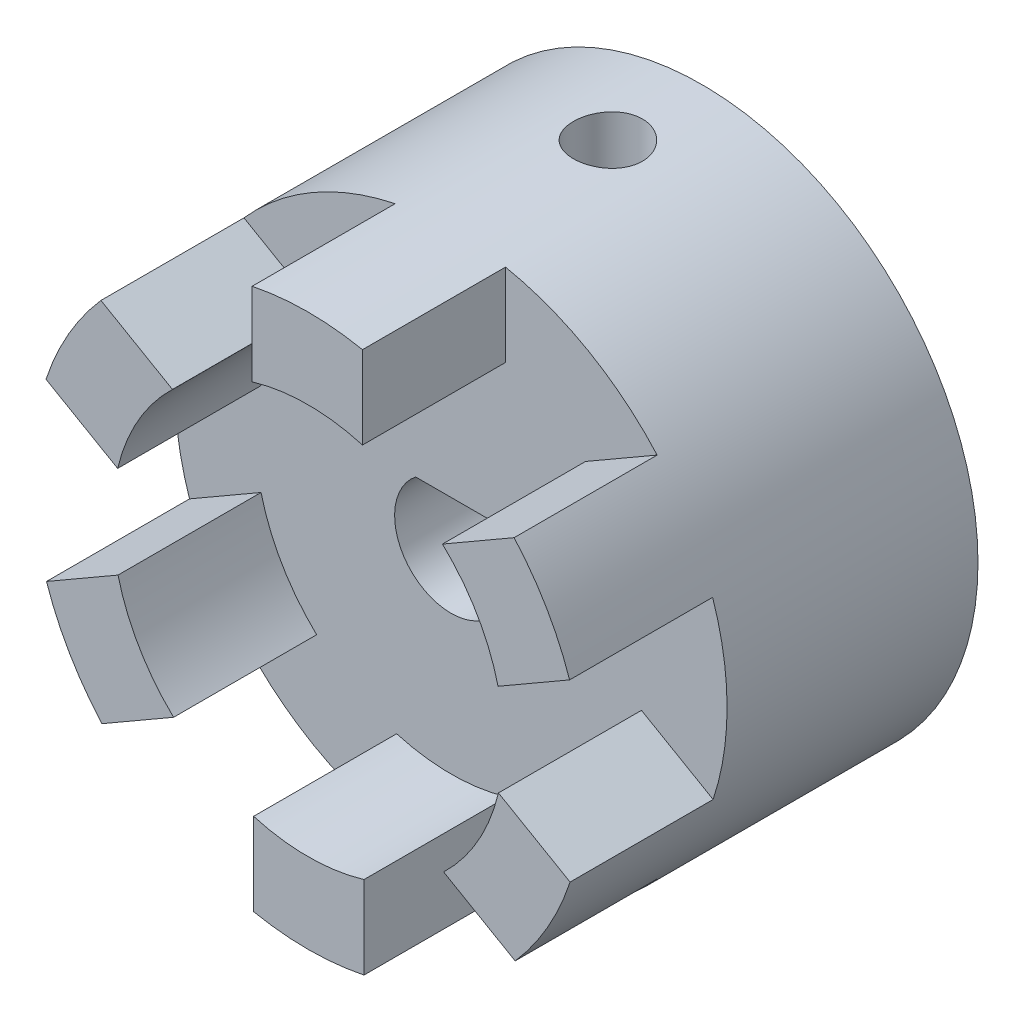
ISO-10303-21;
HEADER;
FILE_DESCRIPTION(('STEP AP214'),'2;1');
FILE_NAME('part.step','',(''),(''),'','','');
FILE_SCHEMA(('AUTOMOTIVE_DESIGN { 1 0 10303 214 1 1 1 1 }'));
ENDSEC;
DATA;
#1=APPLICATION_CONTEXT('core data for automotive mechanical design processes');
#2=APPLICATION_PROTOCOL_DEFINITION('international standard','automotive_design',2000,#1);
#3=PRODUCT_CONTEXT('',#1,'mechanical');
#4=PRODUCT('Part','Part','',(#3));
#5=PRODUCT_RELATED_PRODUCT_CATEGORY('part','',(#4));
#6=PRODUCT_DEFINITION_FORMATION('','',#4);
#7=PRODUCT_DEFINITION_CONTEXT('part definition',#1,'design');
#8=PRODUCT_DEFINITION('design','',#6,#7);
#9=PRODUCT_DEFINITION_SHAPE('','',#8);
#10=(LENGTH_UNIT() NAMED_UNIT(*) SI_UNIT(.MILLI.,.METRE.));
#11=(NAMED_UNIT(*) PLANE_ANGLE_UNIT() SI_UNIT($,.RADIAN.));
#12=(NAMED_UNIT(*) SI_UNIT($,.STERADIAN.) SOLID_ANGLE_UNIT());
#13=UNCERTAINTY_MEASURE_WITH_UNIT(LENGTH_MEASURE(1.E-05),#10,'distance_accuracy_value','');
#14=(GEOMETRIC_REPRESENTATION_CONTEXT(3) GLOBAL_UNCERTAINTY_ASSIGNED_CONTEXT((#13)) GLOBAL_UNIT_ASSIGNED_CONTEXT((#10,
#11,#12)) REPRESENTATION_CONTEXT('',''));
#15=CARTESIAN_POINT('',(0.,0.,0.));
#16=DIRECTION('',(0.,0.,1.));
#17=DIRECTION('',(1.,0.,0.));
#18=AXIS2_PLACEMENT_3D('',#15,#16,#17);
#19=CARTESIAN_POINT('',(0.,0.,11.4));
#20=DIRECTION('',(0.,0.,-1.));
#21=DIRECTION('',(-1.,0.,0.));
#22=AXIS2_PLACEMENT_3D('',#19,#20,#21);
#23=CYLINDRICAL_SURFACE('',#22,22.);
#24=DIRECTION('',(0.,0.,-1.));
#25=VECTOR('',#24,1.);
#26=CARTESIAN_POINT('',(4.33944019373239,21.5677828903441,11.4));
#27=LINE('',#26,#25);
#28=CARTESIAN_POINT('',(4.33944019373239,21.5677828903441,11.4));
#29=VERTEX_POINT('',#28);
#30=CARTESIAN_POINT('',(4.33944019373239,21.5677828903441,0.));
#31=VERTEX_POINT('',#30);
#32=EDGE_CURVE('E11',#29,#31,#27,.T.);
#33=ORIENTED_EDGE('',*,*,#32,.T.);
#34=CARTESIAN_POINT('',(0.,0.,0.));
#35=DIRECTION('',(0.,0.,1.));
#36=DIRECTION('',(1.,0.,0.));
#37=AXIS2_PLACEMENT_3D('',#34,#35,#36);
#38=CIRCLE('',#37,22.);
#39=CARTESIAN_POINT('',(16.426618960713,14.6344179767951,0.));
#40=VERTEX_POINT('',#39);
#41=EDGE_CURVE('E417',#40,#31,#38,.T.);
#42=ORIENTED_EDGE('',*,*,#41,.F.);
#43=DIRECTION('',(0.,0.,-1.));
#44=VECTOR('',#43,1.);
#45=CARTESIAN_POINT('',(16.426618960713,14.6344179767951,11.4));
#46=LINE('',#45,#44);
#47=CARTESIAN_POINT('',(16.426618960713,14.6344179767951,11.4));
#48=VERTEX_POINT('',#47);
#49=EDGE_CURVE('E409',#48,#40,#46,.T.);
#50=ORIENTED_EDGE('',*,*,#49,.F.);
#51=CARTESIAN_POINT('',(0.,0.,11.4));
#52=DIRECTION('',(0.,0.,1.));
#53=DIRECTION('',(1.,0.,0.));
#54=AXIS2_PLACEMENT_3D('',#51,#52,#53);
#55=CIRCLE('',#54,22.);
#56=CARTESIAN_POINT('',(20.8479679832116,7.02582599919653,11.4));
#57=VERTEX_POINT('',#56);
#58=EDGE_CURVE('E381',#57,#48,#55,.T.);
#59=ORIENTED_EDGE('',*,*,#58,.F.);
#60=DIRECTION('',(0.,0.,-1.));
#61=VECTOR('',#60,1.);
#62=CARTESIAN_POINT('',(20.8479679832116,7.02582599919653,11.4));
#63=LINE('',#62,#61);
#64=CARTESIAN_POINT('',(20.8479679832116,7.02582599919653,0.));
#65=VERTEX_POINT('',#64);
#66=EDGE_CURVE('E413',#57,#65,#63,.T.);
#67=ORIENTED_EDGE('',*,*,#66,.T.);
#68=CARTESIAN_POINT('',(20.8870872178607,-6.90866032986705,0.));
#69=VERTEX_POINT('',#68);
#70=EDGE_CURVE('E973',#69,#65,#38,.T.);
#71=ORIENTED_EDGE('',*,*,#70,.F.);
#72=DIRECTION('',(0.,0.,-1.));
#73=VECTOR('',#72,1.);
#74=CARTESIAN_POINT('',(20.8870872178607,-6.90866032986705,11.4));
#75=LINE('',#74,#73);
#76=CARTESIAN_POINT('',(20.8870872178607,-6.90866032986705,11.4));
#77=VERTEX_POINT('',#76);
#78=EDGE_CURVE('E368',#77,#69,#75,.T.);
#79=ORIENTED_EDGE('',*,*,#78,.F.);
#80=CARTESIAN_POINT('',(0.,0.,11.4));
#81=DIRECTION('',(0.,0.,1.));
#82=DIRECTION('',(1.,0.,0.));
#83=AXIS2_PLACEMENT_3D('',#80,#81,#82);
#84=CIRCLE('',#83,22.);
#85=CARTESIAN_POINT('',(16.5085277894792,-14.5419568911476,11.4));
#86=VERTEX_POINT('',#85);
#87=EDGE_CURVE('E340',#86,#77,#84,.T.);
#88=ORIENTED_EDGE('',*,*,#87,.F.);
#89=DIRECTION('',(0.,0.,-1.));
#90=VECTOR('',#89,1.);
#91=CARTESIAN_POINT('',(16.5085277894792,-14.5419568911476,11.4));
#92=LINE('',#91,#90);
#93=CARTESIAN_POINT('',(16.5085277894792,-14.5419568911476,0.));
#94=VERTEX_POINT('',#93);
#95=EDGE_CURVE('E372',#86,#94,#92,.T.);
#96=ORIENTED_EDGE('',*,*,#95,.T.);
#97=CARTESIAN_POINT('',(4.46046825714772,-21.5430783066622,0.));
#98=VERTEX_POINT('',#97);
#99=EDGE_CURVE('E977',#98,#94,#38,.T.);
#100=ORIENTED_EDGE('',*,*,#99,.F.);
#101=DIRECTION('',(0.,0.,-1.));
#102=VECTOR('',#101,1.);
#103=CARTESIAN_POINT('',(4.46046825714772,-21.5430783066622,11.4));
#104=LINE('',#103,#102);
#105=CARTESIAN_POINT('',(4.46046825714772,-21.5430783066622,11.4));
#106=VERTEX_POINT('',#105);
#107=EDGE_CURVE('E327',#106,#98,#104,.T.);
#108=ORIENTED_EDGE('',*,*,#107,.F.);
#109=CARTESIAN_POINT('',(0.,0.,11.4));
#110=DIRECTION('',(0.,0.,1.));
#111=DIRECTION('',(1.,0.,0.));
#112=AXIS2_PLACEMENT_3D('',#109,#110,#111);
#113=CIRCLE('',#112,22.);
#114=CARTESIAN_POINT('',(-4.33944019373239,-21.5677828903441,11.4));
#115=VERTEX_POINT('',#114);
#116=EDGE_CURVE('E299',#115,#106,#113,.T.);
#117=ORIENTED_EDGE('',*,*,#116,.F.);
#118=DIRECTION('',(0.,0.,-1.));
#119=VECTOR('',#118,1.);
#120=CARTESIAN_POINT('',(-4.33944019373239,-21.5677828903441,11.4));
#121=LINE('',#120,#119);
#122=CARTESIAN_POINT('',(-4.33944019373239,-21.5677828903441,0.));
#123=VERTEX_POINT('',#122);
#124=EDGE_CURVE('E331',#115,#123,#121,.T.);
#125=ORIENTED_EDGE('',*,*,#124,.T.);
#126=CARTESIAN_POINT('',(-16.426618960713,-14.6344179767951,0.));
#127=VERTEX_POINT('',#126);
#128=EDGE_CURVE('E984',#127,#123,#38,.T.);
#129=ORIENTED_EDGE('',*,*,#128,.F.);
#130=DIRECTION('',(0.,0.,-1.));
#131=VECTOR('',#130,1.);
#132=CARTESIAN_POINT('',(-16.426618960713,-14.6344179767951,11.4));
#133=LINE('',#132,#131);
#134=CARTESIAN_POINT('',(-16.426618960713,-14.6344179767951,11.4));
#135=VERTEX_POINT('',#134);
#136=EDGE_CURVE('E286',#135,#127,#133,.T.);
#137=ORIENTED_EDGE('',*,*,#136,.F.);
#138=CARTESIAN_POINT('',(0.,0.,11.4));
#139=DIRECTION('',(0.,0.,1.));
#140=DIRECTION('',(1.,0.,0.));
#141=AXIS2_PLACEMENT_3D('',#138,#139,#140);
#142=CIRCLE('',#141,22.);
#143=CARTESIAN_POINT('',(-20.8479679832116,-7.02582599919653,11.4));
#144=VERTEX_POINT('',#143);
#145=EDGE_CURVE('E262',#144,#135,#142,.T.);
#146=ORIENTED_EDGE('',*,*,#145,.F.);
#147=DIRECTION('',(0.,0.,-1.));
#148=VECTOR('',#147,1.);
#149=CARTESIAN_POINT('',(-20.8479679832116,-7.02582599919653,11.4));
#150=LINE('',#149,#148);
#151=CARTESIAN_POINT('',(-20.8479679832116,-7.02582599919653,0.));
#152=VERTEX_POINT('',#151);
#153=EDGE_CURVE('E290',#144,#152,#150,.T.);
#154=ORIENTED_EDGE('',*,*,#153,.T.);
#155=CARTESIAN_POINT('',(-20.8870872178607,6.90866032986705,0.));
#156=VERTEX_POINT('',#155);
#157=EDGE_CURVE('E435',#156,#152,#38,.T.);
#158=ORIENTED_EDGE('',*,*,#157,.F.);
#159=DIRECTION('',(0.,0.,-1.));
#160=VECTOR('',#159,1.);
#161=CARTESIAN_POINT('',(-20.8870872178607,6.90866032986706,11.4));
#162=LINE('',#161,#160);
#163=CARTESIAN_POINT('',(-20.8870872178607,6.90866032986706,11.4));
#164=VERTEX_POINT('',#163);
#165=EDGE_CURVE('E227',#164,#156,#162,.T.);
#166=ORIENTED_EDGE('',*,*,#165,.F.);
#167=CARTESIAN_POINT('',(0.,0.,11.4));
#168=DIRECTION('',(0.,0.,1.));
#169=DIRECTION('',(1.,0.,0.));
#170=AXIS2_PLACEMENT_3D('',#167,#168,#169);
#171=CIRCLE('',#170,22.);
#172=CARTESIAN_POINT('',(-16.5085277894792,14.5419568911476,11.4));
#173=VERTEX_POINT('',#172);
#174=EDGE_CURVE('E219',#173,#164,#171,.T.);
#175=ORIENTED_EDGE('',*,*,#174,.F.);
#176=DIRECTION('',(0.,0.,-1.));
#177=VECTOR('',#176,1.);
#178=CARTESIAN_POINT('',(-16.5085277894792,14.5419568911476,11.4));
#179=LINE('',#178,#177);
#180=CARTESIAN_POINT('',(-16.5085277894792,14.5419568911476,0.));
#181=VERTEX_POINT('',#180);
#182=EDGE_CURVE('E224',#173,#181,#179,.T.);
#183=ORIENTED_EDGE('',*,*,#182,.T.);
#184=CARTESIAN_POINT('',(-4.46046825714771,21.5430783066622,0.));
#185=VERTEX_POINT('',#184);
#186=EDGE_CURVE('E431',#185,#181,#38,.T.);
#187=ORIENTED_EDGE('',*,*,#186,.F.);
#188=DIRECTION('',(0.,0.,-1.));
#189=VECTOR('',#188,1.);
#190=CARTESIAN_POINT('',(-4.46046825714771,21.5430783066622,11.4));
#191=LINE('',#190,#189);
#192=CARTESIAN_POINT('',(-4.46046825714771,21.5430783066622,11.4));
#193=VERTEX_POINT('',#192);
#194=EDGE_CURVE('E55',#193,#185,#191,.T.);
#195=ORIENTED_EDGE('',*,*,#194,.F.);
#196=CARTESIAN_POINT('',(0.,0.,11.4));
#197=DIRECTION('',(0.,0.,1.));
#198=DIRECTION('',(1.,0.,0.));
#199=AXIS2_PLACEMENT_3D('',#196,#197,#198);
#200=CIRCLE('',#199,22.);
#201=EDGE_CURVE('E452',#29,#193,#200,.T.);
#202=ORIENTED_EDGE('',*,*,#201,.F.);
#203=EDGE_LOOP('',(#33,#42,#50,#59,#67,#71,#79,#88,#96,#100,#108,#117,#125,#129,#137,#146,#154,
#158,#166,#175,#183,#187,#195,#202));
#204=FACE_BOUND('',#203,.T.);
#205=CARTESIAN_POINT('',(0.,0.,-20.));
#206=DIRECTION('',(0.,0.,1.));
#207=DIRECTION('',(1.,0.,0.));
#208=AXIS2_PLACEMENT_3D('',#205,#206,#207);
#209=CIRCLE('',#208,22.);
#210=CARTESIAN_POINT('',(22.,0.,-20.));
#211=VERTEX_POINT('',#210);
#212=EDGE_CURVE('E418',#211,#211,#209,.T.);
#213=ORIENTED_EDGE('',*,*,#212,.T.);
#214=EDGE_LOOP('',(#213));
#215=FACE_BOUND('',#214,.T.);
#216=CARTESIAN_POINT('',(0.,22.,-15.25));
#217=CARTESIAN_POINT('',(-0.153825205111337,21.9999978538607,-15.2499934649707));
#218=CARTESIAN_POINT('',(-0.307746531733022,21.9983696301039,-15.2370498329138));
#219=CARTESIAN_POINT('',(-0.611306082298728,21.992030941225,-15.1856194699721));
#220=CARTESIAN_POINT('',(-0.760939663686119,21.9873172578557,-15.1471060682843));
#221=CARTESIAN_POINT('',(-1.05148513229436,21.9753386714885,-15.0456885916945));
#222=CARTESIAN_POINT('',(-1.19240281616075,21.968075486011,-14.9828009340092));
#223=CARTESIAN_POINT('',(-1.46165742238234,21.9518057096591,-14.8344559876332));
#224=CARTESIAN_POINT('',(-1.58999649771201,21.9427994179253,-14.7490025706162));
#225=CARTESIAN_POINT('',(-1.83118409862445,21.9239935343696,-14.5574488551765));
#226=CARTESIAN_POINT('',(-1.94395340143084,21.9141902616166,-14.4512491577191));
#227=CARTESIAN_POINT('',(-2.15011807291324,21.8949249861073,-14.2214308941097));
#228=CARTESIAN_POINT('',(-2.24351245403148,21.885463000767,-14.0978114405954));
#229=CARTESIAN_POINT('',(-2.40857117741233,21.8679153618154,-13.8361480246778));
#230=CARTESIAN_POINT('',(-2.48016130553518,21.859834448957,-13.6980569022753));
#231=CARTESIAN_POINT('',(-2.59910538423263,21.8460124130345,-13.4116942428579));
#232=CARTESIAN_POINT('',(-2.64646025387174,21.8402712012445,-13.2634230921383));
#233=CARTESIAN_POINT('',(-2.71534887802724,21.8318137356397,-12.9617313848546));
#234=CARTESIAN_POINT('',(-2.73701638620487,21.8290818178042,-12.8083418165254));
#235=CARTESIAN_POINT('',(-2.75432910451295,21.8269043095707,-12.500081110181));
#236=CARTESIAN_POINT('',(-2.74997536110266,21.8274585870166,-12.3452100319956));
#237=CARTESIAN_POINT('',(-2.71547896009269,21.8317765090673,-12.0393146900263));
#238=CARTESIAN_POINT('',(-2.68548363928317,21.8355218175636,-11.8882735151797));
#239=CARTESIAN_POINT('',(-2.60078542150026,21.8457711973339,-11.5933854766591));
#240=CARTESIAN_POINT('',(-2.54608202392709,21.852275324503,-11.4495387588146));
#241=CARTESIAN_POINT('',(-2.41336211590281,21.8673302745112,-11.1726652010761));
#242=CARTESIAN_POINT('',(-2.3352815790784,21.8758867053259,-11.0396693697261));
#243=CARTESIAN_POINT('',(-2.15806961640261,21.8940778257366,-10.7886126361454));
#244=CARTESIAN_POINT('',(-2.05893722768885,21.9037125646423,-10.670552417429));
#245=CARTESIAN_POINT('',(-1.84161902182916,21.9230562087947,-10.451863018205));
#246=CARTESIAN_POINT('',(-1.72330620862401,21.9327651662558,-10.3513599990574));
#247=CARTESIAN_POINT('',(-1.47142288602532,21.9511009581144,-10.1716202319664));
#248=CARTESIAN_POINT('',(-1.33785234145008,21.9597277900166,-10.0923835330608));
#249=CARTESIAN_POINT('',(-1.05914783849983,21.9749326744044,-9.9574255474897));
#250=CARTESIAN_POINT('',(-0.914010014871489,21.9815100384169,-9.90171216073065));
#251=CARTESIAN_POINT('',(-0.616338734474162,21.9918686435807,-9.81548245712442));
#252=CARTESIAN_POINT('',(-0.463805624293734,21.9956500156346,-9.78496496064925));
#253=CARTESIAN_POINT('',(-0.156764480304847,21.9999735605184,-9.75015683331339));
#254=CARTESIAN_POINT('',(-0.002276439218468,22.000537197569,-9.74569240839952));
#255=CARTESIAN_POINT('',(0.305245640147245,21.9984197180597,-9.76265850746154));
#256=CARTESIAN_POINT('',(0.458279709321177,21.9957386706003,-9.78408847997675));
#257=CARTESIAN_POINT('',(0.758036958493674,21.9874464563236,-9.85209067965182));
#258=CARTESIAN_POINT('',(0.904779227467175,21.9818449489525,-9.8985800397429));
#259=CARTESIAN_POINT('',(1.18838462034425,21.9683389541022,-10.0152951971042));
#260=CARTESIAN_POINT('',(1.32524740861185,21.9604343884269,-10.0855218003406));
#261=CARTESIAN_POINT('',(1.58598497275617,21.9431500520112,-10.2481384512582));
#262=CARTESIAN_POINT('',(1.7097891359382,21.9337628844676,-10.3406409187862));
#263=CARTESIAN_POINT('',(1.94017668858895,21.9145865655822,-10.5450244472876));
#264=CARTESIAN_POINT('',(2.04675939417054,21.9047973982959,-10.6569062774761));
#265=CARTESIAN_POINT('',(2.24029515469982,21.8858541600884,-10.8976381584329));
#266=CARTESIAN_POINT('',(2.32713300662472,21.8767040219346,-11.0265811809414));
#267=CARTESIAN_POINT('',(2.47791817838785,21.8601395214086,-11.2973240693402));
#268=CARTESIAN_POINT('',(2.5418659571012,21.8527251242413,-11.4391236774242));
#269=CARTESIAN_POINT('',(2.64486923675319,21.8404983543229,-11.7311828510624));
#270=CARTESIAN_POINT('',(2.68398969020282,21.8356791970327,-11.8814192130528));
#271=CARTESIAN_POINT('',(2.73643699325463,21.829169074982,-12.1863927321587));
#272=CARTESIAN_POINT('',(2.74976504278934,21.8274779646965,-12.3411296795549));
#273=CARTESIAN_POINT('',(2.75022718969332,21.827419646807,-12.6495658221251));
#274=CARTESIAN_POINT('',(2.7375422774692,21.8290294722715,-12.8032647731651));
#275=CARTESIAN_POINT('',(2.68672184533426,21.8353422599092,-13.1063278422796));
#276=CARTESIAN_POINT('',(2.64858632269635,21.8400452224139,-13.2556919598897));
#277=CARTESIAN_POINT('',(2.54800378105862,21.85200727352,-13.545821652443));
#278=CARTESIAN_POINT('',(2.48556547906803,21.8592654455206,-13.686590289524));
#279=CARTESIAN_POINT('',(2.33816759236534,21.875521615693,-13.9556813194531));
#280=CARTESIAN_POINT('',(2.25320772546055,21.8845196356645,-14.0840035563218));
#281=CARTESIAN_POINT('',(2.06250696439242,21.9033166522746,-14.3254843478745));
#282=CARTESIAN_POINT('',(1.95663118835245,21.9131205929244,-14.4385360070505));
#283=CARTESIAN_POINT('',(1.72738524966522,21.9323811475219,-14.6453375076848));
#284=CARTESIAN_POINT('',(1.60401096805572,21.9418376790315,-14.7390827918517));
#285=CARTESIAN_POINT('',(1.34273218293963,21.9593776224542,-14.9049138928158));
#286=CARTESIAN_POINT('',(1.20477420755579,21.9674556758613,-14.9769159864892));
#287=CARTESIAN_POINT('',(0.918701192531408,21.981274139844,-15.0966283672079));
#288=CARTESIAN_POINT('',(0.770597388957259,21.9870170890653,-15.1443650489888));
#289=CARTESIAN_POINT('',(0.518106349164718,21.9941339236052,-15.2027652719884));
#290=CARTESIAN_POINT('',(0.415311229868614,21.99632298485,-15.2204528361803));
#291=CARTESIAN_POINT('',(0.20835876953368,21.9992567446211,-15.2440723702625));
#292=CARTESIAN_POINT('',(0.104201438545631,22.0000014537982,-15.2500044268392));
#293=CARTESIAN_POINT('',(0.,22.,-15.25));
#294=B_SPLINE_CURVE_WITH_KNOTS('',3,(#216,#217,#218,#219,#220,#221,#222,#223,#224,#225,#226,
#227,#228,#229,#230,#231,#232,#233,#234,#235,#236,#237,#238,#239,#240,#241,#242,#243,#244,#245,
#246,#247,#248,#249,#250,#251,#252,#253,#254,#255,#256,#257,#258,#259,#260,#261,#262,#263,#264,
#265,#266,#267,#268,#269,#270,#271,#272,#273,#274,#275,#276,#277,#278,#279,#280,#281,#282,#283,
#284,#285,#286,#287,#288,#289,#290,#291,#292,#293),.UNSPECIFIED.,.T.,.F.,(4,2,2,2,2,2,2,2,2,2,2,
2,2,2,2,2,2,2,2,2,2,2,2,2,2,2,2,2,2,2,2,2,2,2,2,2,2,2,4),(0.,0.461095000053872,
0.922671707037769,1.38393805899995,1.8451253215018,2.30857894522027,2.77205618580012,
3.23709375350756,3.70211368446487,4.16470147814953,4.6272706687313,5.08719966085861,
5.54713797182865,6.00834768914087,6.46957850565002,6.93399825950058,7.39841908424425,
7.86299575304765,8.32755066994158,8.78900307331113,9.25044564952121,9.71037159282735,
10.1703131538684,10.6326264322126,11.094958065126,11.5599216865833,12.0248759864369,
12.4886088170902,12.9523200731169,13.4128159132244,13.873311802675,14.3336426717714,
14.7939793090349,15.2573876146101,15.7209051831701,16.1861854334054,16.6509584855244,
16.9633072750639,17.2756537613048),.UNSPECIFIED.);
#295=CARTESIAN_POINT('',(0.,22.,-15.25));
#296=VERTEX_POINT('',#295);
#297=EDGE_CURVE('E510',#296,#296,#294,.T.);
#298=ORIENTED_EDGE('',*,*,#297,.F.);
#299=EDGE_LOOP('',(#298));
#300=FACE_BOUND('',#299,.T.);
#301=ADVANCED_FACE('F45',(#204,#215,#300),#23,.T.);
#302=CARTESIAN_POINT('',(4.33944019373239,0.,11.4));
#303=DIRECTION('',(-1.,0.,0.));
#304=DIRECTION('',(0.,-1.,0.));
#305=AXIS2_PLACEMENT_3D('',#302,#303,#304);
#306=PLANE('',#305);
#307=DIRECTION('',(0.,1.,0.));
#308=VECTOR('',#307,1.);
#309=CARTESIAN_POINT('',(4.33944019373239,0.,0.));
#310=LINE('',#309,#308);
#311=CARTESIAN_POINT('',(4.33944019373239,14.9843004109308,0.));
#312=VERTEX_POINT('',#311);
#313=EDGE_CURVE('E445',#312,#31,#310,.T.);
#314=ORIENTED_EDGE('',*,*,#313,.T.);
#315=ORIENTED_EDGE('',*,*,#32,.F.);
#316=DIRECTION('',(0.,1.,0.));
#317=VECTOR('',#316,1.);
#318=CARTESIAN_POINT('',(4.33944019373239,0.,11.4));
#319=LINE('',#318,#317);
#320=CARTESIAN_POINT('',(4.33944019373239,14.9843004109308,11.4));
#321=VERTEX_POINT('',#320);
#322=EDGE_CURVE('E448',#321,#29,#319,.T.);
#323=ORIENTED_EDGE('',*,*,#322,.F.);
#324=DIRECTION('',(0.,0.,-1.));
#325=VECTOR('',#324,1.);
#326=CARTESIAN_POINT('',(4.33944019373239,14.9843004109308,11.4));
#327=LINE('',#326,#325);
#328=EDGE_CURVE('E464',#321,#312,#327,.T.);
#329=ORIENTED_EDGE('',*,*,#328,.T.);
#330=EDGE_LOOP('',(#314,#315,#323,#329));
#331=FACE_BOUND('',#330,.T.);
#332=ADVANCED_FACE('F47',(#331),#306,.F.);
#333=CARTESIAN_POINT('',(-4.46046825714771,0.,11.4));
#334=DIRECTION('',(-1.,0.,0.));
#335=DIRECTION('',(0.,-1.,0.));
#336=AXIS2_PLACEMENT_3D('',#333,#334,#335);
#337=PLANE('',#336);
#338=DIRECTION('',(0.,1.,0.));
#339=VECTOR('',#338,1.);
#340=CARTESIAN_POINT('',(-4.46046825714771,0.,0.));
#341=LINE('',#340,#339);
#342=CARTESIAN_POINT('',(-4.46046825714771,14.9487197755185,0.));
#343=VERTEX_POINT('',#342);
#344=EDGE_CURVE('E468',#343,#185,#341,.T.);
#345=ORIENTED_EDGE('',*,*,#344,.F.);
#346=DIRECTION('',(0.,0.,-1.));
#347=VECTOR('',#346,1.);
#348=CARTESIAN_POINT('',(-4.46046825714771,14.9487197755185,11.4));
#349=LINE('',#348,#347);
#350=CARTESIAN_POINT('',(-4.46046825714771,14.9487197755185,11.4));
#351=VERTEX_POINT('',#350);
#352=EDGE_CURVE('E477',#351,#343,#349,.T.);
#353=ORIENTED_EDGE('',*,*,#352,.F.);
#354=DIRECTION('',(0.,1.,0.));
#355=VECTOR('',#354,1.);
#356=CARTESIAN_POINT('',(-4.46046825714771,0.,11.4));
#357=LINE('',#356,#355);
#358=EDGE_CURVE('E456',#351,#193,#357,.T.);
#359=ORIENTED_EDGE('',*,*,#358,.T.);
#360=ORIENTED_EDGE('',*,*,#194,.T.);
#361=EDGE_LOOP('',(#345,#353,#359,#360));
#362=FACE_BOUND('',#361,.T.);
#363=ADVANCED_FACE('F484',(#362),#337,.T.);
#364=CARTESIAN_POINT('',(0.,0.,11.4));
#365=DIRECTION('',(0.,0.,-1.));
#366=DIRECTION('',(-1.,0.,0.));
#367=AXIS2_PLACEMENT_3D('',#364,#365,#366);
#368=CYLINDRICAL_SURFACE('',#367,15.6);
#369=CARTESIAN_POINT('',(0.,0.,0.));
#370=DIRECTION('',(0.,0.,1.));
#371=DIRECTION('',(1.,0.,0.));
#372=AXIS2_PLACEMENT_3D('',#369,#370,#371);
#373=CIRCLE('',#372,15.6);
#374=EDGE_CURVE('E453',#312,#343,#373,.T.);
#375=ORIENTED_EDGE('',*,*,#374,.F.);
#376=ORIENTED_EDGE('',*,*,#328,.F.);
#377=CARTESIAN_POINT('',(0.,0.,11.4));
#378=DIRECTION('',(0.,0.,1.));
#379=DIRECTION('',(1.,0.,0.));
#380=AXIS2_PLACEMENT_3D('',#377,#378,#379);
#381=CIRCLE('',#380,15.6);
#382=EDGE_CURVE('E460',#321,#351,#381,.T.);
#383=ORIENTED_EDGE('',*,*,#382,.T.);
#384=ORIENTED_EDGE('',*,*,#352,.T.);
#385=EDGE_LOOP('',(#375,#376,#383,#384));
#386=FACE_BOUND('',#385,.T.);
#387=ADVANCED_FACE('F490',(#386),#368,.F.);
#388=CARTESIAN_POINT('',(0.,0.,11.4));
#389=DIRECTION('',(0.,0.,1.));
#390=DIRECTION('',(1.,0.,0.));
#391=AXIS2_PLACEMENT_3D('',#388,#389,#390);
#392=PLANE('',#391);
#393=ORIENTED_EDGE('',*,*,#322,.T.);
#394=ORIENTED_EDGE('',*,*,#201,.T.);
#395=ORIENTED_EDGE('',*,*,#358,.F.);
#396=ORIENTED_EDGE('',*,*,#382,.F.);
#397=EDGE_LOOP('',(#393,#394,#395,#396));
#398=FACE_BOUND('',#397,.T.);
#399=ADVANCED_FACE('F494',(#398),#392,.T.);
#400=CARTESIAN_POINT('',(0.,0.,0.));
#401=DIRECTION('',(0.,0.,1.));
#402=DIRECTION('',(1.,0.,0.));
#403=AXIS2_PLACEMENT_3D('',#400,#401,#402);
#404=PLANE('',#403);
#405=CARTESIAN_POINT('',(0.,0.,0.));
#406=DIRECTION('',(0.,0.,1.));
#407=DIRECTION('',(1.,0.,0.));
#408=AXIS2_PLACEMENT_3D('',#405,#406,#407);
#409=CIRCLE('',#408,4.5);
#410=CARTESIAN_POINT('',(-2.82842712474619,3.5,0.));
#411=VERTEX_POINT('',#410);
#412=CARTESIAN_POINT('',(2.82842712474619,3.5,0.));
#413=VERTEX_POINT('',#412);
#414=EDGE_CURVE('E434',#411,#413,#409,.T.);
#415=ORIENTED_EDGE('',*,*,#414,.F.);
#416=DIRECTION('',(1.,0.,0.));
#417=VECTOR('',#416,1.);
#418=CARTESIAN_POINT('',(0.,3.5,0.));
#419=LINE('',#418,#417);
#420=EDGE_CURVE('E423',#411,#413,#419,.T.);
#421=ORIENTED_EDGE('',*,*,#420,.T.);
#422=EDGE_LOOP('',(#415,#421));
#423=FACE_BOUND('',#422,.T.);
#424=ORIENTED_EDGE('',*,*,#186,.T.);
#425=DIRECTION('',(-0.866025403784438,0.5,0.));
#426=VECTOR('',#425,1.);
#427=CARTESIAN_POINT('',(2.1697200968662,3.75806544597551,0.));
#428=LINE('',#427,#426);
#429=CARTESIAN_POINT('',(-10.8070647169374,11.2502156514409,0.));
#430=VERTEX_POINT('',#429);
#431=EDGE_CURVE('E245',#430,#181,#428,.T.);
#432=ORIENTED_EDGE('',*,*,#431,.F.);
#433=CARTESIAN_POINT('',(0.,0.,0.));
#434=DIRECTION('',(0.,0.,1.));
#435=DIRECTION('',(1.,0.,0.));
#436=AXIS2_PLACEMENT_3D('',#433,#434,#435);
#437=CIRCLE('',#436,15.6);
#438=CARTESIAN_POINT('',(-15.1762052082277,3.61148106429523,0.));
#439=VERTEX_POINT('',#438);
#440=EDGE_CURVE('E62',#430,#439,#437,.T.);
#441=ORIENTED_EDGE('',*,*,#440,.T.);
#442=DIRECTION('',(-0.866025403784439,0.499999999999999,0.));
#443=VECTOR('',#442,1.);
#444=CARTESIAN_POINT('',(-2.23023412857384,-3.862878823464,0.));
#445=LINE('',#444,#443);
#446=EDGE_CURVE('E67',#439,#156,#445,.T.);
#447=ORIENTED_EDGE('',*,*,#446,.T.);
#448=ORIENTED_EDGE('',*,*,#157,.T.);
#449=DIRECTION('',(-0.866025403784439,-0.5,0.));
#450=VECTOR('',#449,1.);
#451=CARTESIAN_POINT('',(-2.1697200968662,3.75806544597552,0.));
#452=LINE('',#451,#450);
#453=CARTESIAN_POINT('',(-15.1465049106698,-3.73408475948986,0.));
#454=VERTEX_POINT('',#453);
#455=EDGE_CURVE('E247',#454,#152,#452,.T.);
#456=ORIENTED_EDGE('',*,*,#455,.F.);
#457=CARTESIAN_POINT('',(0.,0.,0.));
#458=DIRECTION('',(0.,0.,1.));
#459=DIRECTION('',(1.,0.,0.));
#460=AXIS2_PLACEMENT_3D('',#457,#458,#459);
#461=CIRCLE('',#460,15.6);
#462=CARTESIAN_POINT('',(-10.71573695108,-11.3372387112233,0.));
#463=VERTEX_POINT('',#462);
#464=EDGE_CURVE('E263',#454,#463,#461,.T.);
#465=ORIENTED_EDGE('',*,*,#464,.T.);
#466=DIRECTION('',(-0.866025403784438,-0.500000000000001,0.));
#467=VECTOR('',#466,1.);
#468=CARTESIAN_POINT('',(2.23023412857386,-3.86287882346401,0.));
#469=LINE('',#468,#467);
#470=EDGE_CURVE('E252',#463,#127,#469,.T.);
#471=ORIENTED_EDGE('',*,*,#470,.T.);
#472=ORIENTED_EDGE('',*,*,#128,.T.);
#473=DIRECTION('',(0.,-1.,0.));
#474=VECTOR('',#473,1.);
#475=CARTESIAN_POINT('',(-4.33944019373239,0.,0.));
#476=LINE('',#475,#474);
#477=CARTESIAN_POINT('',(-4.33944019373239,-14.9843004109308,0.));
#478=VERTEX_POINT('',#477);
#479=EDGE_CURVE('E294',#478,#123,#476,.T.);
#480=ORIENTED_EDGE('',*,*,#479,.F.);
#481=CARTESIAN_POINT('',(0.,0.,0.));
#482=DIRECTION('',(0.,0.,1.));
#483=DIRECTION('',(1.,0.,0.));
#484=AXIS2_PLACEMENT_3D('',#481,#482,#483);
#485=CIRCLE('',#484,15.6);
#486=CARTESIAN_POINT('',(4.46046825714771,-14.9487197755185,0.));
#487=VERTEX_POINT('',#486);
#488=EDGE_CURVE('E300',#478,#487,#485,.T.);
#489=ORIENTED_EDGE('',*,*,#488,.T.);
#490=DIRECTION('',(0.,-1.,0.));
#491=VECTOR('',#490,1.);
#492=CARTESIAN_POINT('',(4.46046825714771,0.,0.));
#493=LINE('',#492,#491);
#494=EDGE_CURVE('E315',#487,#98,#493,.T.);
#495=ORIENTED_EDGE('',*,*,#494,.T.);
#496=ORIENTED_EDGE('',*,*,#99,.T.);
#497=DIRECTION('',(0.866025403784439,-0.5,0.));
#498=VECTOR('',#497,1.);
#499=CARTESIAN_POINT('',(-2.16972009686619,-3.75806544597551,0.));
#500=LINE('',#499,#498);
#501=CARTESIAN_POINT('',(10.8070647169374,-11.2502156514409,0.));
#502=VERTEX_POINT('',#501);
#503=EDGE_CURVE('E335',#502,#94,#500,.T.);
#504=ORIENTED_EDGE('',*,*,#503,.F.);
#505=CARTESIAN_POINT('',(0.,0.,0.));
#506=DIRECTION('',(0.,0.,1.));
#507=DIRECTION('',(1.,0.,0.));
#508=AXIS2_PLACEMENT_3D('',#505,#506,#507);
#509=CIRCLE('',#508,15.6);
#510=CARTESIAN_POINT('',(15.1762052082277,-3.61148106429523,0.));
#511=VERTEX_POINT('',#510);
#512=EDGE_CURVE('E341',#502,#511,#509,.T.);
#513=ORIENTED_EDGE('',*,*,#512,.T.);
#514=DIRECTION('',(0.866025403784439,-0.499999999999999,0.));
#515=VECTOR('',#514,1.);
#516=CARTESIAN_POINT('',(2.23023412857384,3.86287882346401,0.));
#517=LINE('',#516,#515);
#518=EDGE_CURVE('E356',#511,#69,#517,.T.);
#519=ORIENTED_EDGE('',*,*,#518,.T.);
#520=ORIENTED_EDGE('',*,*,#70,.T.);
#521=DIRECTION('',(0.866025403784439,0.5,0.));
#522=VECTOR('',#521,1.);
#523=CARTESIAN_POINT('',(2.1697200968662,-3.75806544597552,0.));
#524=LINE('',#523,#522);
#525=CARTESIAN_POINT('',(15.1465049106698,3.73408475948986,0.));
#526=VERTEX_POINT('',#525);
#527=EDGE_CURVE('E376',#526,#65,#524,.T.);
#528=ORIENTED_EDGE('',*,*,#527,.F.);
#529=CARTESIAN_POINT('',(0.,0.,0.));
#530=DIRECTION('',(0.,0.,1.));
#531=DIRECTION('',(1.,0.,0.));
#532=AXIS2_PLACEMENT_3D('',#529,#530,#531);
#533=CIRCLE('',#532,15.6);
#534=CARTESIAN_POINT('',(10.71573695108,11.3372387112233,0.));
#535=VERTEX_POINT('',#534);
#536=EDGE_CURVE('E382',#526,#535,#533,.T.);
#537=ORIENTED_EDGE('',*,*,#536,.T.);
#538=DIRECTION('',(0.866025403784438,0.500000000000001,0.));
#539=VECTOR('',#538,1.);
#540=CARTESIAN_POINT('',(-2.23023412857385,3.86287882346401,0.));
#541=LINE('',#540,#539);
#542=EDGE_CURVE('E397',#535,#40,#541,.T.);
#543=ORIENTED_EDGE('',*,*,#542,.T.);
#544=ORIENTED_EDGE('',*,*,#41,.T.);
#545=ORIENTED_EDGE('',*,*,#313,.F.);
#546=ORIENTED_EDGE('',*,*,#374,.T.);
#547=ORIENTED_EDGE('',*,*,#344,.T.);
#548=EDGE_LOOP('',(#424,#432,#441,#447,#448,#456,#465,#471,#472,#480,#489,#495,#496,#504,#513,
#519,#520,#528,#537,#543,#544,#545,#546,#547));
#549=FACE_BOUND('',#548,.T.);
#550=ADVANCED_FACE('F486',(#423,#549),#404,.T.);
#551=CARTESIAN_POINT('',(0.,0.,-20.));
#552=DIRECTION('',(0.,0.,1.));
#553=DIRECTION('',(1.,0.,0.));
#554=AXIS2_PLACEMENT_3D('',#551,#552,#553);
#555=CYLINDRICAL_SURFACE('',#554,4.5);
#556=ORIENTED_EDGE('',*,*,#414,.T.);
#557=DIRECTION('',(0.,0.,1.));
#558=VECTOR('',#557,1.);
#559=CARTESIAN_POINT('',(2.82842712474619,3.5,-20.));
#560=LINE('',#559,#558);
#561=CARTESIAN_POINT('',(2.82842712474619,3.5,-20.));
#562=VERTEX_POINT('',#561);
#563=EDGE_CURVE('E442',#562,#413,#560,.T.);
#564=ORIENTED_EDGE('',*,*,#563,.F.);
#565=CARTESIAN_POINT('',(0.,0.,-20.));
#566=DIRECTION('',(0.,0.,1.));
#567=DIRECTION('',(1.,0.,0.));
#568=AXIS2_PLACEMENT_3D('',#565,#566,#567);
#569=CIRCLE('',#568,4.5);
#570=CARTESIAN_POINT('',(-2.82842712474619,3.5,-20.));
#571=VERTEX_POINT('',#570);
#572=EDGE_CURVE('E422',#571,#562,#569,.T.);
#573=ORIENTED_EDGE('',*,*,#572,.F.);
#574=DIRECTION('',(0.,0.,1.));
#575=VECTOR('',#574,1.);
#576=CARTESIAN_POINT('',(-2.82842712474619,3.5,-20.));
#577=LINE('',#576,#575);
#578=EDGE_CURVE('E430',#571,#411,#577,.T.);
#579=ORIENTED_EDGE('',*,*,#578,.T.);
#580=EDGE_LOOP('',(#556,#564,#573,#579));
#581=FACE_BOUND('',#580,.T.);
#582=ADVANCED_FACE('F605',(#581),#555,.F.);
#583=CARTESIAN_POINT('',(0.,3.5,-20.));
#584=DIRECTION('',(0.,-1.,0.));
#585=DIRECTION('',(0.,0.,-1.));
#586=AXIS2_PLACEMENT_3D('',#583,#584,#585);
#587=PLANE('',#586);
#588=CARTESIAN_POINT('',(0.,3.5,-12.5));
#589=DIRECTION('',(0.,-1.,0.));
#590=DIRECTION('',(0.,0.,-1.));
#591=AXIS2_PLACEMENT_3D('',#588,#589,#590);
#592=CIRCLE('',#591,2.75);
#593=CARTESIAN_POINT('',(0.,3.5,-15.25));
#594=VERTEX_POINT('',#593);
#595=EDGE_CURVE('E49',#594,#594,#592,.F.);
#596=ORIENTED_EDGE('',*,*,#595,.T.);
#597=EDGE_LOOP('',(#596));
#598=FACE_BOUND('',#597,.T.);
#599=ORIENTED_EDGE('',*,*,#420,.F.);
#600=ORIENTED_EDGE('',*,*,#578,.F.);
#601=DIRECTION('',(1.,0.,0.));
#602=VECTOR('',#601,1.);
#603=CARTESIAN_POINT('',(0.,3.5,-20.));
#604=LINE('',#603,#602);
#605=EDGE_CURVE('E426',#571,#562,#604,.T.);
#606=ORIENTED_EDGE('',*,*,#605,.T.);
#607=ORIENTED_EDGE('',*,*,#563,.T.);
#608=EDGE_LOOP('',(#599,#600,#606,#607));
#609=FACE_BOUND('',#608,.T.);
#610=ADVANCED_FACE('F601',(#598,#609),#587,.T.);
#611=CARTESIAN_POINT('',(0.,0.,-20.));
#612=DIRECTION('',(0.,0.,1.));
#613=DIRECTION('',(1.,0.,0.));
#614=AXIS2_PLACEMENT_3D('',#611,#612,#613);
#615=PLANE('',#614);
#616=ORIENTED_EDGE('',*,*,#212,.F.);
#617=EDGE_LOOP('',(#616));
#618=FACE_BOUND('',#617,.T.);
#619=ORIENTED_EDGE('',*,*,#572,.T.);
#620=ORIENTED_EDGE('',*,*,#605,.F.);
#621=EDGE_LOOP('',(#619,#620));
#622=FACE_BOUND('',#621,.T.);
#623=ADVANCED_FACE('F597',(#618,#622),#615,.F.);
#624=CARTESIAN_POINT('',(2.1697200968662,-3.75806544597552,11.4));
#625=DIRECTION('',(-0.5,0.866025403784439,0.));
#626=DIRECTION('',(-0.866025403784439,-0.5,0.));
#627=AXIS2_PLACEMENT_3D('',#624,#625,#626);
#628=PLANE('',#627);
#629=ORIENTED_EDGE('',*,*,#527,.T.);
#630=ORIENTED_EDGE('',*,*,#66,.F.);
#631=DIRECTION('',(0.866025403784439,0.5,0.));
#632=VECTOR('',#631,1.);
#633=CARTESIAN_POINT('',(2.1697200968662,-3.75806544597552,11.4));
#634=LINE('',#633,#632);
#635=CARTESIAN_POINT('',(15.1465049106698,3.73408475948986,11.4));
#636=VERTEX_POINT('',#635);
#637=EDGE_CURVE('E377',#636,#57,#634,.T.);
#638=ORIENTED_EDGE('',*,*,#637,.F.);
#639=DIRECTION('',(0.,0.,-1.));
#640=VECTOR('',#639,1.);
#641=CARTESIAN_POINT('',(15.1465049106698,3.73408475948986,11.4));
#642=LINE('',#641,#640);
#643=EDGE_CURVE('E393',#636,#526,#642,.T.);
#644=ORIENTED_EDGE('',*,*,#643,.T.);
#645=EDGE_LOOP('',(#629,#630,#638,#644));
#646=FACE_BOUND('',#645,.T.);
#647=ADVANCED_FACE('F593',(#646),#628,.F.);
#648=CARTESIAN_POINT('',(-2.23023412857385,3.86287882346401,11.4));
#649=DIRECTION('',(-0.500000000000001,0.866025403784438,0.));
#650=DIRECTION('',(-0.866025403784438,-0.500000000000001,0.));
#651=AXIS2_PLACEMENT_3D('',#648,#649,#650);
#652=PLANE('',#651);
#653=ORIENTED_EDGE('',*,*,#542,.F.);
#654=DIRECTION('',(0.,0.,-1.));
#655=VECTOR('',#654,1.);
#656=CARTESIAN_POINT('',(10.71573695108,11.3372387112233,11.4));
#657=LINE('',#656,#655);
#658=CARTESIAN_POINT('',(10.71573695108,11.3372387112233,11.4));
#659=VERTEX_POINT('',#658);
#660=EDGE_CURVE('E405',#659,#535,#657,.T.);
#661=ORIENTED_EDGE('',*,*,#660,.F.);
#662=DIRECTION('',(0.866025403784438,0.500000000000001,0.));
#663=VECTOR('',#662,1.);
#664=CARTESIAN_POINT('',(-2.23023412857385,3.86287882346401,11.4));
#665=LINE('',#664,#663);
#666=EDGE_CURVE('E385',#659,#48,#665,.T.);
#667=ORIENTED_EDGE('',*,*,#666,.T.);
#668=ORIENTED_EDGE('',*,*,#49,.T.);
#669=EDGE_LOOP('',(#653,#661,#667,#668));
#670=FACE_BOUND('',#669,.T.);
#671=ADVANCED_FACE('F589',(#670),#652,.T.);
#672=CARTESIAN_POINT('',(0.,0.,11.4));
#673=DIRECTION('',(0.,0.,-1.));
#674=DIRECTION('',(-1.,0.,0.));
#675=AXIS2_PLACEMENT_3D('',#672,#673,#674);
#676=CYLINDRICAL_SURFACE('',#675,15.6);
#677=ORIENTED_EDGE('',*,*,#536,.F.);
#678=ORIENTED_EDGE('',*,*,#643,.F.);
#679=CARTESIAN_POINT('',(0.,0.,11.4));
#680=DIRECTION('',(0.,0.,1.));
#681=DIRECTION('',(1.,0.,0.));
#682=AXIS2_PLACEMENT_3D('',#679,#680,#681);
#683=CIRCLE('',#682,15.6);
#684=EDGE_CURVE('E389',#636,#659,#683,.T.);
#685=ORIENTED_EDGE('',*,*,#684,.T.);
#686=ORIENTED_EDGE('',*,*,#660,.T.);
#687=EDGE_LOOP('',(#677,#678,#685,#686));
#688=FACE_BOUND('',#687,.T.);
#689=ADVANCED_FACE('F585',(#688),#676,.F.);
#690=CARTESIAN_POINT('',(0.,0.,11.4));
#691=DIRECTION('',(0.,0.,1.));
#692=DIRECTION('',(1.,0.,0.));
#693=AXIS2_PLACEMENT_3D('',#690,#691,#692);
#694=PLANE('',#693);
#695=ORIENTED_EDGE('',*,*,#637,.T.);
#696=ORIENTED_EDGE('',*,*,#58,.T.);
#697=ORIENTED_EDGE('',*,*,#666,.F.);
#698=ORIENTED_EDGE('',*,*,#684,.F.);
#699=EDGE_LOOP('',(#695,#696,#697,#698));
#700=FACE_BOUND('',#699,.T.);
#701=ADVANCED_FACE('F581',(#700),#694,.T.);
#702=CARTESIAN_POINT('',(-2.16972009686619,-3.75806544597551,11.4));
#703=DIRECTION('',(0.5,0.866025403784439,0.));
#704=DIRECTION('',(-0.866025403784439,0.5,0.));
#705=AXIS2_PLACEMENT_3D('',#702,#703,#704);
#706=PLANE('',#705);
#707=ORIENTED_EDGE('',*,*,#503,.T.);
#708=ORIENTED_EDGE('',*,*,#95,.F.);
#709=DIRECTION('',(0.866025403784439,-0.5,0.));
#710=VECTOR('',#709,1.);
#711=CARTESIAN_POINT('',(-2.16972009686619,-3.75806544597551,11.4));
#712=LINE('',#711,#710);
#713=CARTESIAN_POINT('',(10.8070647169374,-11.2502156514409,11.4));
#714=VERTEX_POINT('',#713);
#715=EDGE_CURVE('E336',#714,#86,#712,.T.);
#716=ORIENTED_EDGE('',*,*,#715,.F.);
#717=DIRECTION('',(0.,0.,-1.));
#718=VECTOR('',#717,1.);
#719=CARTESIAN_POINT('',(10.8070647169374,-11.2502156514409,11.4));
#720=LINE('',#719,#718);
#721=EDGE_CURVE('E352',#714,#502,#720,.T.);
#722=ORIENTED_EDGE('',*,*,#721,.T.);
#723=EDGE_LOOP('',(#707,#708,#716,#722));
#724=FACE_BOUND('',#723,.T.);
#725=ADVANCED_FACE('F577',(#724),#706,.F.);
#726=CARTESIAN_POINT('',(2.23023412857384,3.86287882346401,11.4));
#727=DIRECTION('',(0.499999999999999,0.866025403784439,0.));
#728=DIRECTION('',(-0.866025403784439,0.499999999999999,0.));
#729=AXIS2_PLACEMENT_3D('',#726,#727,#728);
#730=PLANE('',#729);
#731=ORIENTED_EDGE('',*,*,#518,.F.);
#732=DIRECTION('',(0.,0.,-1.));
#733=VECTOR('',#732,1.);
#734=CARTESIAN_POINT('',(15.1762052082277,-3.61148106429523,11.4));
#735=LINE('',#734,#733);
#736=CARTESIAN_POINT('',(15.1762052082277,-3.61148106429523,11.4));
#737=VERTEX_POINT('',#736);
#738=EDGE_CURVE('E364',#737,#511,#735,.T.);
#739=ORIENTED_EDGE('',*,*,#738,.F.);
#740=DIRECTION('',(0.866025403784439,-0.499999999999999,0.));
#741=VECTOR('',#740,1.);
#742=CARTESIAN_POINT('',(2.23023412857384,3.86287882346401,11.4));
#743=LINE('',#742,#741);
#744=EDGE_CURVE('E344',#737,#77,#743,.T.);
#745=ORIENTED_EDGE('',*,*,#744,.T.);
#746=ORIENTED_EDGE('',*,*,#78,.T.);
#747=EDGE_LOOP('',(#731,#739,#745,#746));
#748=FACE_BOUND('',#747,.T.);
#749=ADVANCED_FACE('F573',(#748),#730,.T.);
#750=CARTESIAN_POINT('',(0.,0.,11.4));
#751=DIRECTION('',(0.,0.,-1.));
#752=DIRECTION('',(-1.,0.,0.));
#753=AXIS2_PLACEMENT_3D('',#750,#751,#752);
#754=CYLINDRICAL_SURFACE('',#753,15.6);
#755=ORIENTED_EDGE('',*,*,#512,.F.);
#756=ORIENTED_EDGE('',*,*,#721,.F.);
#757=CARTESIAN_POINT('',(0.,0.,11.4));
#758=DIRECTION('',(0.,0.,1.));
#759=DIRECTION('',(1.,0.,0.));
#760=AXIS2_PLACEMENT_3D('',#757,#758,#759);
#761=CIRCLE('',#760,15.6);
#762=EDGE_CURVE('E348',#714,#737,#761,.T.);
#763=ORIENTED_EDGE('',*,*,#762,.T.);
#764=ORIENTED_EDGE('',*,*,#738,.T.);
#765=EDGE_LOOP('',(#755,#756,#763,#764));
#766=FACE_BOUND('',#765,.T.);
#767=ADVANCED_FACE('F569',(#766),#754,.F.);
#768=CARTESIAN_POINT('',(0.,0.,11.4));
#769=DIRECTION('',(0.,0.,1.));
#770=DIRECTION('',(1.,0.,0.));
#771=AXIS2_PLACEMENT_3D('',#768,#769,#770);
#772=PLANE('',#771);
#773=ORIENTED_EDGE('',*,*,#715,.T.);
#774=ORIENTED_EDGE('',*,*,#87,.T.);
#775=ORIENTED_EDGE('',*,*,#744,.F.);
#776=ORIENTED_EDGE('',*,*,#762,.F.);
#777=EDGE_LOOP('',(#773,#774,#775,#776));
#778=FACE_BOUND('',#777,.T.);
#779=ADVANCED_FACE('F565',(#778),#772,.T.);
#780=CARTESIAN_POINT('',(-4.33944019373239,0.,11.4));
#781=DIRECTION('',(1.,0.,0.));
#782=DIRECTION('',(0.,1.,0.));
#783=AXIS2_PLACEMENT_3D('',#780,#781,#782);
#784=PLANE('',#783);
#785=ORIENTED_EDGE('',*,*,#479,.T.);
#786=ORIENTED_EDGE('',*,*,#124,.F.);
#787=DIRECTION('',(0.,-1.,0.));
#788=VECTOR('',#787,1.);
#789=CARTESIAN_POINT('',(-4.33944019373239,0.,11.4));
#790=LINE('',#789,#788);
#791=CARTESIAN_POINT('',(-4.33944019373239,-14.9843004109308,11.4));
#792=VERTEX_POINT('',#791);
#793=EDGE_CURVE('E295',#792,#115,#790,.T.);
#794=ORIENTED_EDGE('',*,*,#793,.F.);
#795=DIRECTION('',(0.,0.,-1.));
#796=VECTOR('',#795,1.);
#797=CARTESIAN_POINT('',(-4.33944019373239,-14.9843004109308,11.4));
#798=LINE('',#797,#796);
#799=EDGE_CURVE('E311',#792,#478,#798,.T.);
#800=ORIENTED_EDGE('',*,*,#799,.T.);
#801=EDGE_LOOP('',(#785,#786,#794,#800));
#802=FACE_BOUND('',#801,.T.);
#803=ADVANCED_FACE('F561',(#802),#784,.F.);
#804=CARTESIAN_POINT('',(4.46046825714771,0.,11.4));
#805=DIRECTION('',(1.,0.,0.));
#806=DIRECTION('',(0.,1.,0.));
#807=AXIS2_PLACEMENT_3D('',#804,#805,#806);
#808=PLANE('',#807);
#809=ORIENTED_EDGE('',*,*,#494,.F.);
#810=DIRECTION('',(0.,0.,-1.));
#811=VECTOR('',#810,1.);
#812=CARTESIAN_POINT('',(4.46046825714771,-14.9487197755185,11.4));
#813=LINE('',#812,#811);
#814=CARTESIAN_POINT('',(4.46046825714771,-14.9487197755185,11.4));
#815=VERTEX_POINT('',#814);
#816=EDGE_CURVE('E323',#815,#487,#813,.T.);
#817=ORIENTED_EDGE('',*,*,#816,.F.);
#818=DIRECTION('',(0.,-1.,0.));
#819=VECTOR('',#818,1.);
#820=CARTESIAN_POINT('',(4.46046825714771,0.,11.4));
#821=LINE('',#820,#819);
#822=EDGE_CURVE('E303',#815,#106,#821,.T.);
#823=ORIENTED_EDGE('',*,*,#822,.T.);
#824=ORIENTED_EDGE('',*,*,#107,.T.);
#825=EDGE_LOOP('',(#809,#817,#823,#824));
#826=FACE_BOUND('',#825,.T.);
#827=ADVANCED_FACE('F557',(#826),#808,.T.);
#828=CARTESIAN_POINT('',(0.,0.,11.4));
#829=DIRECTION('',(0.,0.,-1.));
#830=DIRECTION('',(-1.,0.,0.));
#831=AXIS2_PLACEMENT_3D('',#828,#829,#830);
#832=CYLINDRICAL_SURFACE('',#831,15.6);
#833=ORIENTED_EDGE('',*,*,#488,.F.);
#834=ORIENTED_EDGE('',*,*,#799,.F.);
#835=CARTESIAN_POINT('',(0.,0.,11.4));
#836=DIRECTION('',(0.,0.,1.));
#837=DIRECTION('',(1.,0.,0.));
#838=AXIS2_PLACEMENT_3D('',#835,#836,#837);
#839=CIRCLE('',#838,15.6);
#840=EDGE_CURVE('E307',#792,#815,#839,.T.);
#841=ORIENTED_EDGE('',*,*,#840,.T.);
#842=ORIENTED_EDGE('',*,*,#816,.T.);
#843=EDGE_LOOP('',(#833,#834,#841,#842));
#844=FACE_BOUND('',#843,.T.);
#845=ADVANCED_FACE('F553',(#844),#832,.F.);
#846=CARTESIAN_POINT('',(0.,0.,11.4));
#847=DIRECTION('',(0.,0.,1.));
#848=DIRECTION('',(1.,0.,0.));
#849=AXIS2_PLACEMENT_3D('',#846,#847,#848);
#850=PLANE('',#849);
#851=ORIENTED_EDGE('',*,*,#793,.T.);
#852=ORIENTED_EDGE('',*,*,#116,.T.);
#853=ORIENTED_EDGE('',*,*,#822,.F.);
#854=ORIENTED_EDGE('',*,*,#840,.F.);
#855=EDGE_LOOP('',(#851,#852,#853,#854));
#856=FACE_BOUND('',#855,.T.);
#857=ADVANCED_FACE('F549',(#856),#850,.T.);
#858=CARTESIAN_POINT('',(-2.1697200968662,3.75806544597552,11.4));
#859=DIRECTION('',(0.5,-0.866025403784439,0.));
#860=DIRECTION('',(0.866025403784439,0.5,0.));
#861=AXIS2_PLACEMENT_3D('',#858,#859,#860);
#862=PLANE('',#861);
#863=ORIENTED_EDGE('',*,*,#455,.T.);
#864=ORIENTED_EDGE('',*,*,#153,.F.);
#865=DIRECTION('',(-0.866025403784439,-0.5,0.));
#866=VECTOR('',#865,1.);
#867=CARTESIAN_POINT('',(-2.1697200968662,3.75806544597552,11.4));
#868=LINE('',#867,#866);
#869=CARTESIAN_POINT('',(-15.1465049106698,-3.73408475948986,11.4));
#870=VERTEX_POINT('',#869);
#871=EDGE_CURVE('E258',#870,#144,#868,.T.);
#872=ORIENTED_EDGE('',*,*,#871,.F.);
#873=DIRECTION('',(0.,0.,-1.));
#874=VECTOR('',#873,1.);
#875=CARTESIAN_POINT('',(-15.1465049106698,-3.73408475948986,11.4));
#876=LINE('',#875,#874);
#877=EDGE_CURVE('E273',#870,#454,#876,.T.);
#878=ORIENTED_EDGE('',*,*,#877,.T.);
#879=EDGE_LOOP('',(#863,#864,#872,#878));
#880=FACE_BOUND('',#879,.T.);
#881=ADVANCED_FACE('F545',(#880),#862,.F.);
#882=CARTESIAN_POINT('',(2.23023412857386,-3.86287882346401,11.4));
#883=DIRECTION('',(0.500000000000001,-0.866025403784438,0.));
#884=DIRECTION('',(0.866025403784438,0.500000000000001,0.));
#885=AXIS2_PLACEMENT_3D('',#882,#883,#884);
#886=PLANE('',#885);
#887=ORIENTED_EDGE('',*,*,#470,.F.);
#888=DIRECTION('',(0.,0.,-1.));
#889=VECTOR('',#888,1.);
#890=CARTESIAN_POINT('',(-10.71573695108,-11.3372387112233,11.4));
#891=LINE('',#890,#889);
#892=CARTESIAN_POINT('',(-10.71573695108,-11.3372387112233,11.4));
#893=VERTEX_POINT('',#892);
#894=EDGE_CURVE('E282',#893,#463,#891,.T.);
#895=ORIENTED_EDGE('',*,*,#894,.F.);
#896=DIRECTION('',(-0.866025403784438,-0.500000000000001,0.));
#897=VECTOR('',#896,1.);
#898=CARTESIAN_POINT('',(2.23023412857386,-3.86287882346401,11.4));
#899=LINE('',#898,#897);
#900=EDGE_CURVE('E266',#893,#135,#899,.T.);
#901=ORIENTED_EDGE('',*,*,#900,.T.);
#902=ORIENTED_EDGE('',*,*,#136,.T.);
#903=EDGE_LOOP('',(#887,#895,#901,#902));
#904=FACE_BOUND('',#903,.T.);
#905=ADVANCED_FACE('F541',(#904),#886,.T.);
#906=CARTESIAN_POINT('',(0.,0.,11.4));
#907=DIRECTION('',(0.,0.,-1.));
#908=DIRECTION('',(-1.,0.,0.));
#909=AXIS2_PLACEMENT_3D('',#906,#907,#908);
#910=CYLINDRICAL_SURFACE('',#909,15.6);
#911=ORIENTED_EDGE('',*,*,#464,.F.);
#912=ORIENTED_EDGE('',*,*,#877,.F.);
#913=CARTESIAN_POINT('',(0.,0.,11.4));
#914=DIRECTION('',(0.,0.,1.));
#915=DIRECTION('',(1.,0.,0.));
#916=AXIS2_PLACEMENT_3D('',#913,#914,#915);
#917=CIRCLE('',#916,15.6);
#918=EDGE_CURVE('E270',#870,#893,#917,.T.);
#919=ORIENTED_EDGE('',*,*,#918,.T.);
#920=ORIENTED_EDGE('',*,*,#894,.T.);
#921=EDGE_LOOP('',(#911,#912,#919,#920));
#922=FACE_BOUND('',#921,.T.);
#923=ADVANCED_FACE('F537',(#922),#910,.F.);
#924=CARTESIAN_POINT('',(0.,0.,11.4));
#925=DIRECTION('',(0.,0.,1.));
#926=DIRECTION('',(1.,0.,0.));
#927=AXIS2_PLACEMENT_3D('',#924,#925,#926);
#928=PLANE('',#927);
#929=ORIENTED_EDGE('',*,*,#871,.T.);
#930=ORIENTED_EDGE('',*,*,#145,.T.);
#931=ORIENTED_EDGE('',*,*,#900,.F.);
#932=ORIENTED_EDGE('',*,*,#918,.F.);
#933=EDGE_LOOP('',(#929,#930,#931,#932));
#934=FACE_BOUND('',#933,.T.);
#935=ADVANCED_FACE('F534',(#934),#928,.T.);
#936=CARTESIAN_POINT('',(2.1697200968662,3.75806544597551,11.4));
#937=DIRECTION('',(-0.500000000000001,-0.866025403784438,0.));
#938=DIRECTION('',(0.866025403784438,-0.500000000000001,0.));
#939=AXIS2_PLACEMENT_3D('',#936,#937,#938);
#940=PLANE('',#939);
#941=ORIENTED_EDGE('',*,*,#431,.T.);
#942=ORIENTED_EDGE('',*,*,#182,.F.);
#943=DIRECTION('',(-0.866025403784438,0.5,0.));
#944=VECTOR('',#943,1.);
#945=CARTESIAN_POINT('',(2.1697200968662,3.75806544597551,11.4));
#946=LINE('',#945,#944);
#947=CARTESIAN_POINT('',(-10.8070647169374,11.2502156514409,11.4));
#948=VERTEX_POINT('',#947);
#949=EDGE_CURVE('E233',#948,#173,#946,.T.);
#950=ORIENTED_EDGE('',*,*,#949,.F.);
#951=DIRECTION('',(0.,0.,-1.));
#952=VECTOR('',#951,1.);
#953=CARTESIAN_POINT('',(-10.8070647169374,11.2502156514409,11.4));
#954=LINE('',#953,#952);
#955=EDGE_CURVE('E961',#948,#430,#954,.T.);
#956=ORIENTED_EDGE('',*,*,#955,.T.);
#957=EDGE_LOOP('',(#941,#942,#950,#956));
#958=FACE_BOUND('',#957,.T.);
#959=ADVANCED_FACE('F244',(#958),#940,.F.);
#960=CARTESIAN_POINT('',(-2.23023412857384,-3.862878823464,11.4));
#961=DIRECTION('',(-0.499999999999999,-0.866025403784439,0.));
#962=DIRECTION('',(0.866025403784439,-0.499999999999999,0.));
#963=AXIS2_PLACEMENT_3D('',#960,#961,#962);
#964=PLANE('',#963);
#965=ORIENTED_EDGE('',*,*,#446,.F.);
#966=DIRECTION('',(0.,0.,-1.));
#967=VECTOR('',#966,1.);
#968=CARTESIAN_POINT('',(-15.1762052082277,3.61148106429523,11.4));
#969=LINE('',#968,#967);
#970=CARTESIAN_POINT('',(-15.1762052082277,3.61148106429523,11.4));
#971=VERTEX_POINT('',#970);
#972=EDGE_CURVE('E254',#971,#439,#969,.T.);
#973=ORIENTED_EDGE('',*,*,#972,.F.);
#974=DIRECTION('',(-0.866025403784439,0.499999999999999,0.));
#975=VECTOR('',#974,1.);
#976=CARTESIAN_POINT('',(-2.23023412857384,-3.862878823464,11.4));
#977=LINE('',#976,#975);
#978=EDGE_CURVE('E232',#971,#164,#977,.T.);
#979=ORIENTED_EDGE('',*,*,#978,.T.);
#980=ORIENTED_EDGE('',*,*,#165,.T.);
#981=EDGE_LOOP('',(#965,#973,#979,#980));
#982=FACE_BOUND('',#981,.T.);
#983=ADVANCED_FACE('F527',(#982),#964,.T.);
#984=CARTESIAN_POINT('',(0.,0.,11.4));
#985=DIRECTION('',(0.,0.,-1.));
#986=DIRECTION('',(-1.,0.,0.));
#987=AXIS2_PLACEMENT_3D('',#984,#985,#986);
#988=CYLINDRICAL_SURFACE('',#987,15.6);
#989=ORIENTED_EDGE('',*,*,#440,.F.);
#990=ORIENTED_EDGE('',*,*,#955,.F.);
#991=CARTESIAN_POINT('',(0.,0.,11.4));
#992=DIRECTION('',(0.,0.,1.));
#993=DIRECTION('',(1.,0.,0.));
#994=AXIS2_PLACEMENT_3D('',#991,#992,#993);
#995=CIRCLE('',#994,15.6);
#996=EDGE_CURVE('E239',#948,#971,#995,.T.);
#997=ORIENTED_EDGE('',*,*,#996,.T.);
#998=ORIENTED_EDGE('',*,*,#972,.T.);
#999=EDGE_LOOP('',(#989,#990,#997,#998));
#1000=FACE_BOUND('',#999,.T.);
#1001=ADVANCED_FACE('F524',(#1000),#988,.F.);
#1002=CARTESIAN_POINT('',(0.,0.,11.4));
#1003=DIRECTION('',(0.,0.,1.));
#1004=DIRECTION('',(1.,0.,0.));
#1005=AXIS2_PLACEMENT_3D('',#1002,#1003,#1004);
#1006=PLANE('',#1005);
#1007=ORIENTED_EDGE('',*,*,#949,.T.);
#1008=ORIENTED_EDGE('',*,*,#174,.T.);
#1009=ORIENTED_EDGE('',*,*,#978,.F.);
#1010=ORIENTED_EDGE('',*,*,#996,.F.);
#1011=EDGE_LOOP('',(#1007,#1008,#1009,#1010));
#1012=FACE_BOUND('',#1011,.T.);
#1013=ADVANCED_FACE('F237',(#1012),#1006,.T.);
#1014=CARTESIAN_POINT('',(0.,30.,-12.5));
#1015=DIRECTION('',(0.,-1.,0.));
#1016=DIRECTION('',(0.,0.,-1.));
#1017=AXIS2_PLACEMENT_3D('',#1014,#1015,#1016);
#1018=CYLINDRICAL_SURFACE('',#1017,2.75);
#1019=ORIENTED_EDGE('',*,*,#595,.F.);
#1020=EDGE_LOOP('',(#1019));
#1021=FACE_BOUND('',#1020,.T.);
#1022=ORIENTED_EDGE('',*,*,#297,.T.);
#1023=EDGE_LOOP('',(#1022));
#1024=FACE_BOUND('',#1023,.T.);
#1025=ADVANCED_FACE('F517',(#1021,#1024),#1018,.F.);
#1026=CLOSED_SHELL('',(#301,#332,#363,#387,#399,#550,#582,#610,#623,#647,#671,#689,#701,#725,
#749,#767,#779,#803,#827,#845,#857,#881,#905,#923,#935,#959,#983,#1001,#1013,#1025));
#1027=MANIFOLD_SOLID_BREP('B2',#1026);
#1028=ADVANCED_BREP_SHAPE_REPRESENTATION('',(#18,#1027),#14);
#1029=SHAPE_DEFINITION_REPRESENTATION(#9,#1028);
ENDSEC;
END-ISO-10303-21;
